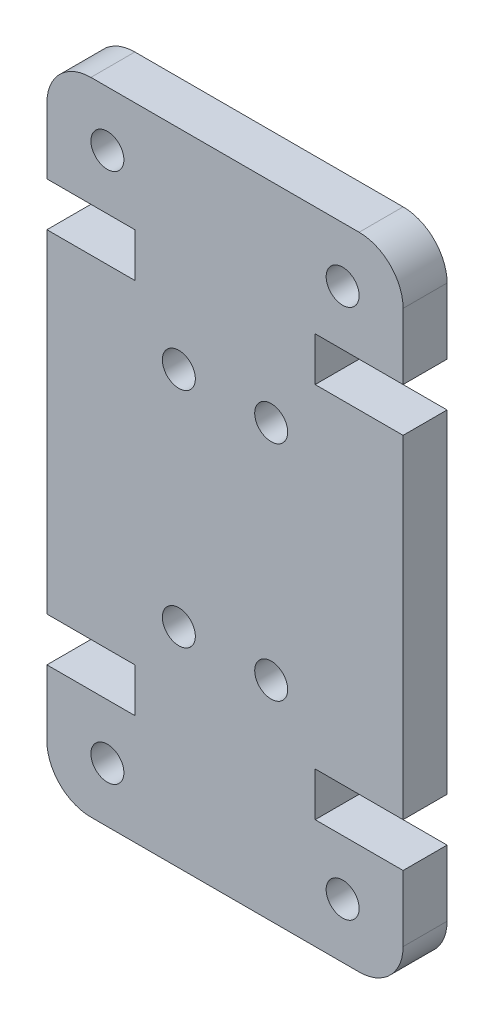
ISO-10303-21;
HEADER;
FILE_DESCRIPTION(('STEP AP214'),'2;1');
FILE_NAME('part.step','',(''),(''),'','','');
FILE_SCHEMA(('AUTOMOTIVE_DESIGN { 1 0 10303 214 1 1 1 1 }'));
ENDSEC;
DATA;
#1=APPLICATION_CONTEXT('core data for automotive mechanical design processes');
#2=APPLICATION_PROTOCOL_DEFINITION('international standard','automotive_design',2000,#1);
#3=PRODUCT_CONTEXT('',#1,'mechanical');
#4=PRODUCT('Part','Part','',(#3));
#5=PRODUCT_RELATED_PRODUCT_CATEGORY('part','',(#4));
#6=PRODUCT_DEFINITION_FORMATION('','',#4);
#7=PRODUCT_DEFINITION_CONTEXT('part definition',#1,'design');
#8=PRODUCT_DEFINITION('design','',#6,#7);
#9=PRODUCT_DEFINITION_SHAPE('','',#8);
#10=(LENGTH_UNIT() NAMED_UNIT(*) SI_UNIT(.MILLI.,.METRE.));
#11=(NAMED_UNIT(*) PLANE_ANGLE_UNIT() SI_UNIT($,.RADIAN.));
#12=(NAMED_UNIT(*) SI_UNIT($,.STERADIAN.) SOLID_ANGLE_UNIT());
#13=UNCERTAINTY_MEASURE_WITH_UNIT(LENGTH_MEASURE(1.E-05),#10,'distance_accuracy_value','');
#14=(GEOMETRIC_REPRESENTATION_CONTEXT(3) GLOBAL_UNCERTAINTY_ASSIGNED_CONTEXT((#13)) GLOBAL_UNIT_ASSIGNED_CONTEXT((#10,
#11,#12)) REPRESENTATION_CONTEXT('',''));
#15=CARTESIAN_POINT('',(0.,0.,0.));
#16=DIRECTION('',(0.,0.,1.));
#17=DIRECTION('',(1.,0.,0.));
#18=AXIS2_PLACEMENT_3D('',#15,#16,#17);
#19=CARTESIAN_POINT('',(2.00000000000002,2.,2.));
#20=DIRECTION('',(0.,0.,1.));
#21=DIRECTION('',(1.,0.,0.));
#22=AXIS2_PLACEMENT_3D('',#19,#20,#21);
#23=PLANE('',#22);
#24=CARTESIAN_POINT('',(10.2,19.6400000000004,2.));
#25=DIRECTION('',(0.,0.,1.));
#26=DIRECTION('',(1.,0.,0.));
#27=AXIS2_PLACEMENT_3D('',#24,#25,#26);
#28=CIRCLE('',#27,0.750000000000002);
#29=CARTESIAN_POINT('',(10.95,19.6400000000004,2.));
#30=VERTEX_POINT('',#29);
#31=EDGE_CURVE('E465',#30,#30,#28,.T.);
#32=ORIENTED_EDGE('',*,*,#31,.F.);
#33=EDGE_LOOP('',(#32));
#34=FACE_BOUND('',#33,.T.);
#35=CARTESIAN_POINT('',(6.,19.6400000000004,2.));
#36=DIRECTION('',(0.,0.,1.));
#37=DIRECTION('',(-1.,0.,0.));
#38=AXIS2_PLACEMENT_3D('',#35,#36,#37);
#39=CIRCLE('',#38,0.750000000000001);
#40=CARTESIAN_POINT('',(5.25,19.6400000000004,2.));
#41=VERTEX_POINT('',#40);
#42=EDGE_CURVE('E477',#41,#41,#39,.T.);
#43=ORIENTED_EDGE('',*,*,#42,.F.);
#44=EDGE_LOOP('',(#43));
#45=FACE_BOUND('',#44,.T.);
#46=CARTESIAN_POINT('',(2.75000000000004,26.6399999999998,2.));
#47=DIRECTION('',(0.,0.,1.));
#48=DIRECTION('',(-1.,0.,0.));
#49=AXIS2_PLACEMENT_3D('',#46,#47,#48);
#50=CIRCLE('',#49,0.750000000000001);
#51=CARTESIAN_POINT('',(2.00000000000004,26.6399999999998,2.));
#52=VERTEX_POINT('',#51);
#53=EDGE_CURVE('E489',#52,#52,#50,.T.);
#54=ORIENTED_EDGE('',*,*,#53,.F.);
#55=EDGE_LOOP('',(#54));
#56=FACE_BOUND('',#55,.T.);
#57=CARTESIAN_POINT('',(13.45,2.50000000000017,2.));
#58=DIRECTION('',(0.,0.,1.));
#59=DIRECTION('',(-1.,0.,0.));
#60=AXIS2_PLACEMENT_3D('',#57,#58,#59);
#61=CIRCLE('',#60,0.750000000000002);
#62=CARTESIAN_POINT('',(12.7,2.50000000000017,2.));
#63=VERTEX_POINT('',#62);
#64=EDGE_CURVE('E231',#63,#63,#61,.T.);
#65=ORIENTED_EDGE('',*,*,#64,.F.);
#66=EDGE_LOOP('',(#65));
#67=FACE_BOUND('',#66,.T.);
#68=DIRECTION('',(1.,0.,0.));
#69=VECTOR('',#68,1.);
#70=CARTESIAN_POINT('',(0.,6.99999999999946,2.));
#71=LINE('',#70,#69);
#72=CARTESIAN_POINT('',(0.,6.99999999999946,2.));
#73=VERTEX_POINT('',#72);
#74=CARTESIAN_POINT('',(4.00000000000002,6.99999999999946,2.));
#75=VERTEX_POINT('',#74);
#76=EDGE_CURVE('E274',#73,#75,#71,.T.);
#77=ORIENTED_EDGE('',*,*,#76,.T.);
#78=DIRECTION('',(0.,-1.,0.));
#79=VECTOR('',#78,1.);
#80=CARTESIAN_POINT('',(4.00000000000002,6.99999999999946,2.));
#81=LINE('',#80,#79);
#82=CARTESIAN_POINT('',(4.,4.99999999999945,2.));
#83=VERTEX_POINT('',#82);
#84=EDGE_CURVE('E142',#75,#83,#81,.T.);
#85=ORIENTED_EDGE('',*,*,#84,.T.);
#86=DIRECTION('',(-1.,0.,0.));
#87=VECTOR('',#86,1.);
#88=CARTESIAN_POINT('',(4.,4.99999999999945,2.));
#89=LINE('',#88,#87);
#90=CARTESIAN_POINT('',(0.,4.99999999999945,2.));
#91=VERTEX_POINT('',#90);
#92=EDGE_CURVE('E337',#83,#91,#89,.T.);
#93=ORIENTED_EDGE('',*,*,#92,.T.);
#94=DIRECTION('',(0.,-1.,0.));
#95=VECTOR('',#94,1.);
#96=CARTESIAN_POINT('',(0.,2.,2.));
#97=LINE('',#96,#95);
#98=CARTESIAN_POINT('',(0.,2.,2.));
#99=VERTEX_POINT('',#98);
#100=EDGE_CURVE('E356',#91,#99,#97,.T.);
#101=ORIENTED_EDGE('',*,*,#100,.T.);
#102=CARTESIAN_POINT('',(2.00000000000002,2.,2.));
#103=DIRECTION('',(0.,0.,1.));
#104=DIRECTION('',(1.,0.,0.));
#105=AXIS2_PLACEMENT_3D('',#102,#103,#104);
#106=CIRCLE('',#105,2.00000000000001);
#107=CARTESIAN_POINT('',(2.00000000000002,0.,2.));
#108=VERTEX_POINT('',#107);
#109=EDGE_CURVE('E353',#99,#108,#106,.T.);
#110=ORIENTED_EDGE('',*,*,#109,.T.);
#111=DIRECTION('',(1.,0.,0.));
#112=VECTOR('',#111,1.);
#113=CARTESIAN_POINT('',(2.00000000000002,0.,2.));
#114=LINE('',#113,#112);
#115=CARTESIAN_POINT('',(14.2,0.,2.));
#116=VERTEX_POINT('',#115);
#117=EDGE_CURVE('E355',#108,#116,#114,.T.);
#118=ORIENTED_EDGE('',*,*,#117,.T.);
#119=CARTESIAN_POINT('',(14.2,2.,2.));
#120=DIRECTION('',(0.,0.,1.));
#121=DIRECTION('',(-1.,0.,0.));
#122=AXIS2_PLACEMENT_3D('',#119,#120,#121);
#123=CIRCLE('',#122,2.);
#124=CARTESIAN_POINT('',(16.2,2.,2.));
#125=VERTEX_POINT('',#124);
#126=EDGE_CURVE('E358',#116,#125,#123,.T.);
#127=ORIENTED_EDGE('',*,*,#126,.T.);
#128=DIRECTION('',(0.,1.,0.));
#129=VECTOR('',#128,1.);
#130=CARTESIAN_POINT('',(16.2,2.,2.));
#131=LINE('',#130,#129);
#132=CARTESIAN_POINT('',(16.2,4.99999999999945,2.));
#133=VERTEX_POINT('',#132);
#134=EDGE_CURVE('E364',#125,#133,#131,.T.);
#135=ORIENTED_EDGE('',*,*,#134,.T.);
#136=DIRECTION('',(-1.,0.,0.));
#137=VECTOR('',#136,1.);
#138=CARTESIAN_POINT('',(12.2,4.99999999999945,2.));
#139=LINE('',#138,#137);
#140=CARTESIAN_POINT('',(12.2,4.99999999999945,2.));
#141=VERTEX_POINT('',#140);
#142=EDGE_CURVE('E366',#133,#141,#139,.T.);
#143=ORIENTED_EDGE('',*,*,#142,.T.);
#144=DIRECTION('',(0.,1.,0.));
#145=VECTOR('',#144,1.);
#146=CARTESIAN_POINT('',(12.2,6.99999999999945,2.));
#147=LINE('',#146,#145);
#148=CARTESIAN_POINT('',(12.2,6.99999999999945,2.));
#149=VERTEX_POINT('',#148);
#150=EDGE_CURVE('E368',#141,#149,#147,.T.);
#151=ORIENTED_EDGE('',*,*,#150,.T.);
#152=DIRECTION('',(1.,0.,0.));
#153=VECTOR('',#152,1.);
#154=CARTESIAN_POINT('',(16.2,6.99999999999945,2.));
#155=LINE('',#154,#153);
#156=CARTESIAN_POINT('',(16.2,6.99999999999945,2.));
#157=VERTEX_POINT('',#156);
#158=EDGE_CURVE('E370',#149,#157,#155,.T.);
#159=ORIENTED_EDGE('',*,*,#158,.T.);
#160=DIRECTION('',(0.,1.,0.));
#161=VECTOR('',#160,1.);
#162=CARTESIAN_POINT('',(16.2,22.1400000000005,2.));
#163=LINE('',#162,#161);
#164=CARTESIAN_POINT('',(16.2,22.1400000000005,2.));
#165=VERTEX_POINT('',#164);
#166=EDGE_CURVE('E372',#157,#165,#163,.T.);
#167=ORIENTED_EDGE('',*,*,#166,.T.);
#168=DIRECTION('',(-1.,0.,0.));
#169=VECTOR('',#168,1.);
#170=CARTESIAN_POINT('',(16.2,22.1400000000005,2.));
#171=LINE('',#170,#169);
#172=CARTESIAN_POINT('',(12.2,22.1400000000005,2.));
#173=VERTEX_POINT('',#172);
#174=EDGE_CURVE('E374',#165,#173,#171,.T.);
#175=ORIENTED_EDGE('',*,*,#174,.T.);
#176=DIRECTION('',(0.,1.,0.));
#177=VECTOR('',#176,1.);
#178=CARTESIAN_POINT('',(12.2,22.1400000000005,2.));
#179=LINE('',#178,#177);
#180=CARTESIAN_POINT('',(12.2,24.1400000000006,2.));
#181=VERTEX_POINT('',#180);
#182=EDGE_CURVE('E376',#173,#181,#179,.T.);
#183=ORIENTED_EDGE('',*,*,#182,.T.);
#184=DIRECTION('',(1.,0.,0.));
#185=VECTOR('',#184,1.);
#186=CARTESIAN_POINT('',(12.2,24.1400000000006,2.));
#187=LINE('',#186,#185);
#188=CARTESIAN_POINT('',(16.2,24.1400000000006,2.));
#189=VERTEX_POINT('',#188);
#190=EDGE_CURVE('E378',#181,#189,#187,.T.);
#191=ORIENTED_EDGE('',*,*,#190,.T.);
#192=DIRECTION('',(0.,1.,0.));
#193=VECTOR('',#192,1.);
#194=CARTESIAN_POINT('',(16.2,27.14,2.));
#195=LINE('',#194,#193);
#196=CARTESIAN_POINT('',(16.2,27.14,2.));
#197=VERTEX_POINT('',#196);
#198=EDGE_CURVE('E380',#189,#197,#195,.T.);
#199=ORIENTED_EDGE('',*,*,#198,.T.);
#200=CARTESIAN_POINT('',(14.2,27.14,2.));
#201=DIRECTION('',(0.,0.,1.));
#202=DIRECTION('',(1.,0.,0.));
#203=AXIS2_PLACEMENT_3D('',#200,#201,#202);
#204=CIRCLE('',#203,2.);
#205=CARTESIAN_POINT('',(14.2,29.14,2.));
#206=VERTEX_POINT('',#205);
#207=EDGE_CURVE('E382',#197,#206,#204,.T.);
#208=ORIENTED_EDGE('',*,*,#207,.T.);
#209=DIRECTION('',(-1.,0.,0.));
#210=VECTOR('',#209,1.);
#211=CARTESIAN_POINT('',(1.99999999999999,29.14,2.));
#212=LINE('',#211,#210);
#213=CARTESIAN_POINT('',(1.99999999999999,29.14,2.));
#214=VERTEX_POINT('',#213);
#215=EDGE_CURVE('E384',#206,#214,#212,.T.);
#216=ORIENTED_EDGE('',*,*,#215,.T.);
#217=CARTESIAN_POINT('',(2.,27.14,2.));
#218=DIRECTION('',(0.,0.,1.));
#219=DIRECTION('',(-1.,0.,0.));
#220=AXIS2_PLACEMENT_3D('',#217,#218,#219);
#221=CIRCLE('',#220,2.);
#222=CARTESIAN_POINT('',(0.,27.14,2.));
#223=VERTEX_POINT('',#222);
#224=EDGE_CURVE('E386',#214,#223,#221,.T.);
#225=ORIENTED_EDGE('',*,*,#224,.T.);
#226=DIRECTION('',(0.,-1.,0.));
#227=VECTOR('',#226,1.);
#228=CARTESIAN_POINT('',(0.,27.14,2.));
#229=LINE('',#228,#227);
#230=CARTESIAN_POINT('',(0.,24.1400000000005,2.));
#231=VERTEX_POINT('',#230);
#232=EDGE_CURVE('E388',#223,#231,#229,.T.);
#233=ORIENTED_EDGE('',*,*,#232,.T.);
#234=DIRECTION('',(1.,0.,0.));
#235=VECTOR('',#234,1.);
#236=CARTESIAN_POINT('',(3.99999999999999,24.1400000000006,2.));
#237=LINE('',#236,#235);
#238=CARTESIAN_POINT('',(3.99999999999999,24.1400000000006,2.));
#239=VERTEX_POINT('',#238);
#240=EDGE_CURVE('E209',#231,#239,#237,.T.);
#241=ORIENTED_EDGE('',*,*,#240,.T.);
#242=DIRECTION('',(0.,-1.,0.));
#243=VECTOR('',#242,1.);
#244=CARTESIAN_POINT('',(4.,22.1400000000005,2.));
#245=LINE('',#244,#243);
#246=CARTESIAN_POINT('',(4.,22.1400000000005,2.));
#247=VERTEX_POINT('',#246);
#248=EDGE_CURVE('E203',#239,#247,#245,.T.);
#249=ORIENTED_EDGE('',*,*,#248,.T.);
#250=DIRECTION('',(-1.,0.,0.));
#251=VECTOR('',#250,1.);
#252=CARTESIAN_POINT('',(0.,22.1400000000005,2.));
#253=LINE('',#252,#251);
#254=CARTESIAN_POINT('',(0.,22.1400000000005,2.));
#255=VERTEX_POINT('',#254);
#256=EDGE_CURVE('E207',#247,#255,#253,.T.);
#257=ORIENTED_EDGE('',*,*,#256,.T.);
#258=DIRECTION('',(0.,-1.,0.));
#259=VECTOR('',#258,1.);
#260=CARTESIAN_POINT('',(0.,22.1400000000005,2.));
#261=LINE('',#260,#259);
#262=EDGE_CURVE('E51',#255,#73,#261,.T.);
#263=ORIENTED_EDGE('',*,*,#262,.T.);
#264=EDGE_LOOP('',(#77,#85,#93,#101,#110,#118,#127,#135,#143,#151,#159,#167,#175,#183,#191,#199,
#208,#216,#225,#233,#241,#249,#257,#263));
#265=FACE_BOUND('',#264,.T.);
#266=CARTESIAN_POINT('',(10.2,9.49999999999962,2.));
#267=DIRECTION('',(0.,0.,1.));
#268=DIRECTION('',(-1.,0.,0.));
#269=AXIS2_PLACEMENT_3D('',#266,#267,#268);
#270=CIRCLE('',#269,0.750000000000002);
#271=CARTESIAN_POINT('',(9.44999999999999,9.49999999999962,2.));
#272=VERTEX_POINT('',#271);
#273=EDGE_CURVE('E495',#272,#272,#270,.T.);
#274=ORIENTED_EDGE('',*,*,#273,.F.);
#275=EDGE_LOOP('',(#274));
#276=FACE_BOUND('',#275,.T.);
#277=CARTESIAN_POINT('',(6.00000000000001,9.49999999999962,2.));
#278=DIRECTION('',(0.,0.,1.));
#279=DIRECTION('',(1.,0.,0.));
#280=AXIS2_PLACEMENT_3D('',#277,#278,#279);
#281=CIRCLE('',#280,0.75);
#282=CARTESIAN_POINT('',(6.75000000000001,9.49999999999962,2.));
#283=VERTEX_POINT('',#282);
#284=EDGE_CURVE('E483',#283,#283,#281,.T.);
#285=ORIENTED_EDGE('',*,*,#284,.F.);
#286=EDGE_LOOP('',(#285));
#287=FACE_BOUND('',#286,.T.);
#288=CARTESIAN_POINT('',(2.75000000000004,2.50000000000017,2.));
#289=DIRECTION('',(0.,0.,1.));
#290=DIRECTION('',(1.,0.,0.));
#291=AXIS2_PLACEMENT_3D('',#288,#289,#290);
#292=CIRCLE('',#291,0.75);
#293=CARTESIAN_POINT('',(3.50000000000004,2.50000000000017,2.));
#294=VERTEX_POINT('',#293);
#295=EDGE_CURVE('E471',#294,#294,#292,.T.);
#296=ORIENTED_EDGE('',*,*,#295,.F.);
#297=EDGE_LOOP('',(#296));
#298=FACE_BOUND('',#297,.T.);
#299=CARTESIAN_POINT('',(13.45,26.6399999999998,2.));
#300=DIRECTION('',(0.,0.,1.));
#301=DIRECTION('',(1.,0.,0.));
#302=AXIS2_PLACEMENT_3D('',#299,#300,#301);
#303=CIRCLE('',#302,0.750000000000002);
#304=CARTESIAN_POINT('',(14.2,26.6399999999998,2.));
#305=VERTEX_POINT('',#304);
#306=EDGE_CURVE('E456',#305,#305,#303,.T.);
#307=ORIENTED_EDGE('',*,*,#306,.F.);
#308=EDGE_LOOP('',(#307));
#309=FACE_BOUND('',#308,.T.);
#310=ADVANCED_FACE('F34',(#34,#45,#56,#67,#265,#276,#287,#298,#309),#23,.T.);
#311=CARTESIAN_POINT('',(2.00000000000002,2.,0.));
#312=DIRECTION('',(0.,0.,1.));
#313=DIRECTION('',(1.,0.,0.));
#314=AXIS2_PLACEMENT_3D('',#311,#312,#313);
#315=PLANE('',#314);
#316=CARTESIAN_POINT('',(10.2,19.6400000000004,0.));
#317=DIRECTION('',(0.,0.,1.));
#318=DIRECTION('',(1.,0.,0.));
#319=AXIS2_PLACEMENT_3D('',#316,#317,#318);
#320=CIRCLE('',#319,0.750000000000002);
#321=CARTESIAN_POINT('',(10.95,19.6400000000004,0.));
#322=VERTEX_POINT('',#321);
#323=EDGE_CURVE('E462',#322,#322,#320,.T.);
#324=ORIENTED_EDGE('',*,*,#323,.T.);
#325=EDGE_LOOP('',(#324));
#326=FACE_BOUND('',#325,.T.);
#327=CARTESIAN_POINT('',(6.,19.6400000000004,0.));
#328=DIRECTION('',(0.,0.,1.));
#329=DIRECTION('',(-1.,0.,0.));
#330=AXIS2_PLACEMENT_3D('',#327,#328,#329);
#331=CIRCLE('',#330,0.750000000000001);
#332=CARTESIAN_POINT('',(5.25,19.6400000000004,0.));
#333=VERTEX_POINT('',#332);
#334=EDGE_CURVE('E474',#333,#333,#331,.T.);
#335=ORIENTED_EDGE('',*,*,#334,.T.);
#336=EDGE_LOOP('',(#335));
#337=FACE_BOUND('',#336,.T.);
#338=CARTESIAN_POINT('',(2.75000000000004,26.6399999999998,0.));
#339=DIRECTION('',(0.,0.,1.));
#340=DIRECTION('',(-1.,0.,0.));
#341=AXIS2_PLACEMENT_3D('',#338,#339,#340);
#342=CIRCLE('',#341,0.750000000000001);
#343=CARTESIAN_POINT('',(2.00000000000004,26.6399999999998,0.));
#344=VERTEX_POINT('',#343);
#345=EDGE_CURVE('E486',#344,#344,#342,.T.);
#346=ORIENTED_EDGE('',*,*,#345,.T.);
#347=EDGE_LOOP('',(#346));
#348=FACE_BOUND('',#347,.T.);
#349=CARTESIAN_POINT('',(13.45,2.50000000000017,0.));
#350=DIRECTION('',(0.,0.,1.));
#351=DIRECTION('',(-1.,0.,0.));
#352=AXIS2_PLACEMENT_3D('',#349,#350,#351);
#353=CIRCLE('',#352,0.750000000000002);
#354=CARTESIAN_POINT('',(12.7,2.50000000000017,0.));
#355=VERTEX_POINT('',#354);
#356=EDGE_CURVE('E498',#355,#355,#353,.T.);
#357=ORIENTED_EDGE('',*,*,#356,.T.);
#358=EDGE_LOOP('',(#357));
#359=FACE_BOUND('',#358,.T.);
#360=DIRECTION('',(1.,0.,0.));
#361=VECTOR('',#360,1.);
#362=CARTESIAN_POINT('',(0.,6.99999999999946,0.));
#363=LINE('',#362,#361);
#364=CARTESIAN_POINT('',(0.,6.99999999999946,0.));
#365=VERTEX_POINT('',#364);
#366=CARTESIAN_POINT('',(4.00000000000002,6.99999999999946,0.));
#367=VERTEX_POINT('',#366);
#368=EDGE_CURVE('E227',#365,#367,#363,.T.);
#369=ORIENTED_EDGE('',*,*,#368,.F.);
#370=DIRECTION('',(0.,-1.,0.));
#371=VECTOR('',#370,1.);
#372=CARTESIAN_POINT('',(0.,22.1400000000005,0.));
#373=LINE('',#372,#371);
#374=CARTESIAN_POINT('',(0.,22.1400000000005,0.));
#375=VERTEX_POINT('',#374);
#376=EDGE_CURVE('E134',#375,#365,#373,.T.);
#377=ORIENTED_EDGE('',*,*,#376,.F.);
#378=DIRECTION('',(-1.,0.,0.));
#379=VECTOR('',#378,1.);
#380=CARTESIAN_POINT('',(0.,22.1400000000005,0.));
#381=LINE('',#380,#379);
#382=CARTESIAN_POINT('',(4.,22.1400000000005,0.));
#383=VERTEX_POINT('',#382);
#384=EDGE_CURVE('E128',#383,#375,#381,.T.);
#385=ORIENTED_EDGE('',*,*,#384,.F.);
#386=DIRECTION('',(0.,-1.,0.));
#387=VECTOR('',#386,1.);
#388=CARTESIAN_POINT('',(4.,22.1400000000005,0.));
#389=LINE('',#388,#387);
#390=CARTESIAN_POINT('',(3.99999999999999,24.1400000000006,0.));
#391=VERTEX_POINT('',#390);
#392=EDGE_CURVE('E217',#391,#383,#389,.T.);
#393=ORIENTED_EDGE('',*,*,#392,.F.);
#394=DIRECTION('',(1.,0.,0.));
#395=VECTOR('',#394,1.);
#396=CARTESIAN_POINT('',(3.99999999999999,24.1400000000006,0.));
#397=LINE('',#396,#395);
#398=CARTESIAN_POINT('',(0.,24.1400000000005,0.));
#399=VERTEX_POINT('',#398);
#400=EDGE_CURVE('E269',#399,#391,#397,.T.);
#401=ORIENTED_EDGE('',*,*,#400,.F.);
#402=DIRECTION('',(0.,-1.,0.));
#403=VECTOR('',#402,1.);
#404=CARTESIAN_POINT('',(0.,27.14,0.));
#405=LINE('',#404,#403);
#406=CARTESIAN_POINT('',(0.,27.14,0.));
#407=VERTEX_POINT('',#406);
#408=EDGE_CURVE('E267',#407,#399,#405,.T.);
#409=ORIENTED_EDGE('',*,*,#408,.F.);
#410=CARTESIAN_POINT('',(2.,27.14,0.));
#411=DIRECTION('',(0.,0.,1.));
#412=DIRECTION('',(-1.,0.,0.));
#413=AXIS2_PLACEMENT_3D('',#410,#411,#412);
#414=CIRCLE('',#413,2.);
#415=CARTESIAN_POINT('',(1.99999999999999,29.14,0.));
#416=VERTEX_POINT('',#415);
#417=EDGE_CURVE('E265',#416,#407,#414,.T.);
#418=ORIENTED_EDGE('',*,*,#417,.F.);
#419=DIRECTION('',(-1.,0.,0.));
#420=VECTOR('',#419,1.);
#421=CARTESIAN_POINT('',(1.99999999999999,29.14,0.));
#422=LINE('',#421,#420);
#423=CARTESIAN_POINT('',(14.2,29.14,0.));
#424=VERTEX_POINT('',#423);
#425=EDGE_CURVE('E263',#424,#416,#422,.T.);
#426=ORIENTED_EDGE('',*,*,#425,.F.);
#427=CARTESIAN_POINT('',(14.2,27.14,0.));
#428=DIRECTION('',(0.,0.,1.));
#429=DIRECTION('',(1.,0.,0.));
#430=AXIS2_PLACEMENT_3D('',#427,#428,#429);
#431=CIRCLE('',#430,2.);
#432=CARTESIAN_POINT('',(16.2,27.14,0.));
#433=VERTEX_POINT('',#432);
#434=EDGE_CURVE('E261',#433,#424,#431,.T.);
#435=ORIENTED_EDGE('',*,*,#434,.F.);
#436=DIRECTION('',(0.,1.,0.));
#437=VECTOR('',#436,1.);
#438=CARTESIAN_POINT('',(16.2,27.14,0.));
#439=LINE('',#438,#437);
#440=CARTESIAN_POINT('',(16.2,24.1400000000006,0.));
#441=VERTEX_POINT('',#440);
#442=EDGE_CURVE('E259',#441,#433,#439,.T.);
#443=ORIENTED_EDGE('',*,*,#442,.F.);
#444=DIRECTION('',(1.,0.,0.));
#445=VECTOR('',#444,1.);
#446=CARTESIAN_POINT('',(12.2,24.1400000000006,0.));
#447=LINE('',#446,#445);
#448=CARTESIAN_POINT('',(12.2,24.1400000000006,0.));
#449=VERTEX_POINT('',#448);
#450=EDGE_CURVE('E257',#449,#441,#447,.T.);
#451=ORIENTED_EDGE('',*,*,#450,.F.);
#452=DIRECTION('',(0.,1.,0.));
#453=VECTOR('',#452,1.);
#454=CARTESIAN_POINT('',(12.2,22.1400000000005,0.));
#455=LINE('',#454,#453);
#456=CARTESIAN_POINT('',(12.2,22.1400000000005,0.));
#457=VERTEX_POINT('',#456);
#458=EDGE_CURVE('E255',#457,#449,#455,.T.);
#459=ORIENTED_EDGE('',*,*,#458,.F.);
#460=DIRECTION('',(-1.,0.,0.));
#461=VECTOR('',#460,1.);
#462=CARTESIAN_POINT('',(16.2,22.1400000000005,0.));
#463=LINE('',#462,#461);
#464=CARTESIAN_POINT('',(16.2,22.1400000000005,0.));
#465=VERTEX_POINT('',#464);
#466=EDGE_CURVE('E253',#465,#457,#463,.T.);
#467=ORIENTED_EDGE('',*,*,#466,.F.);
#468=DIRECTION('',(0.,1.,0.));
#469=VECTOR('',#468,1.);
#470=CARTESIAN_POINT('',(16.2,22.1400000000005,0.));
#471=LINE('',#470,#469);
#472=CARTESIAN_POINT('',(16.2,6.99999999999945,0.));
#473=VERTEX_POINT('',#472);
#474=EDGE_CURVE('E251',#473,#465,#471,.T.);
#475=ORIENTED_EDGE('',*,*,#474,.F.);
#476=DIRECTION('',(1.,0.,0.));
#477=VECTOR('',#476,1.);
#478=CARTESIAN_POINT('',(16.2,6.99999999999945,0.));
#479=LINE('',#478,#477);
#480=CARTESIAN_POINT('',(12.2,6.99999999999945,0.));
#481=VERTEX_POINT('',#480);
#482=EDGE_CURVE('E249',#481,#473,#479,.T.);
#483=ORIENTED_EDGE('',*,*,#482,.F.);
#484=DIRECTION('',(0.,1.,0.));
#485=VECTOR('',#484,1.);
#486=CARTESIAN_POINT('',(12.2,6.99999999999945,0.));
#487=LINE('',#486,#485);
#488=CARTESIAN_POINT('',(12.2,4.99999999999945,0.));
#489=VERTEX_POINT('',#488);
#490=EDGE_CURVE('E247',#489,#481,#487,.T.);
#491=ORIENTED_EDGE('',*,*,#490,.F.);
#492=DIRECTION('',(-1.,0.,0.));
#493=VECTOR('',#492,1.);
#494=CARTESIAN_POINT('',(12.2,4.99999999999945,0.));
#495=LINE('',#494,#493);
#496=CARTESIAN_POINT('',(16.2,4.99999999999945,0.));
#497=VERTEX_POINT('',#496);
#498=EDGE_CURVE('E245',#497,#489,#495,.T.);
#499=ORIENTED_EDGE('',*,*,#498,.F.);
#500=DIRECTION('',(0.,1.,0.));
#501=VECTOR('',#500,1.);
#502=CARTESIAN_POINT('',(16.2,2.,0.));
#503=LINE('',#502,#501);
#504=CARTESIAN_POINT('',(16.2,2.,0.));
#505=VERTEX_POINT('',#504);
#506=EDGE_CURVE('E243',#505,#497,#503,.T.);
#507=ORIENTED_EDGE('',*,*,#506,.F.);
#508=CARTESIAN_POINT('',(14.2,2.,0.));
#509=DIRECTION('',(0.,0.,1.));
#510=DIRECTION('',(-1.,0.,0.));
#511=AXIS2_PLACEMENT_3D('',#508,#509,#510);
#512=CIRCLE('',#511,2.);
#513=CARTESIAN_POINT('',(14.2,0.,0.));
#514=VERTEX_POINT('',#513);
#515=EDGE_CURVE('E241',#514,#505,#512,.T.);
#516=ORIENTED_EDGE('',*,*,#515,.F.);
#517=DIRECTION('',(1.,0.,0.));
#518=VECTOR('',#517,1.);
#519=CARTESIAN_POINT('',(2.00000000000002,0.,0.));
#520=LINE('',#519,#518);
#521=CARTESIAN_POINT('',(2.00000000000002,0.,0.));
#522=VERTEX_POINT('',#521);
#523=EDGE_CURVE('E239',#522,#514,#520,.T.);
#524=ORIENTED_EDGE('',*,*,#523,.F.);
#525=CARTESIAN_POINT('',(2.00000000000002,2.,0.));
#526=DIRECTION('',(0.,0.,1.));
#527=DIRECTION('',(1.,0.,0.));
#528=AXIS2_PLACEMENT_3D('',#525,#526,#527);
#529=CIRCLE('',#528,2.00000000000001);
#530=CARTESIAN_POINT('',(0.,2.,0.));
#531=VERTEX_POINT('',#530);
#532=EDGE_CURVE('E237',#531,#522,#529,.T.);
#533=ORIENTED_EDGE('',*,*,#532,.F.);
#534=DIRECTION('',(0.,-1.,0.));
#535=VECTOR('',#534,1.);
#536=CARTESIAN_POINT('',(0.,2.,0.));
#537=LINE('',#536,#535);
#538=CARTESIAN_POINT('',(0.,4.99999999999945,0.));
#539=VERTEX_POINT('',#538);
#540=EDGE_CURVE('E235',#539,#531,#537,.T.);
#541=ORIENTED_EDGE('',*,*,#540,.F.);
#542=DIRECTION('',(-1.,0.,0.));
#543=VECTOR('',#542,1.);
#544=CARTESIAN_POINT('',(4.,4.99999999999945,0.));
#545=LINE('',#544,#543);
#546=CARTESIAN_POINT('',(4.,4.99999999999945,0.));
#547=VERTEX_POINT('',#546);
#548=EDGE_CURVE('E233',#547,#539,#545,.T.);
#549=ORIENTED_EDGE('',*,*,#548,.F.);
#550=DIRECTION('',(0.,-1.,0.));
#551=VECTOR('',#550,1.);
#552=CARTESIAN_POINT('',(4.00000000000002,6.99999999999946,0.));
#553=LINE('',#552,#551);
#554=EDGE_CURVE('E230',#367,#547,#553,.T.);
#555=ORIENTED_EDGE('',*,*,#554,.F.);
#556=EDGE_LOOP('',(#369,#377,#385,#393,#401,#409,#418,#426,#435,#443,#451,#459,#467,#475,#483,
#491,#499,#507,#516,#524,#533,#541,#549,#555));
#557=FACE_BOUND('',#556,.T.);
#558=CARTESIAN_POINT('',(10.2,9.49999999999962,0.));
#559=DIRECTION('',(0.,0.,1.));
#560=DIRECTION('',(-1.,0.,0.));
#561=AXIS2_PLACEMENT_3D('',#558,#559,#560);
#562=CIRCLE('',#561,0.750000000000002);
#563=CARTESIAN_POINT('',(9.44999999999999,9.49999999999962,0.));
#564=VERTEX_POINT('',#563);
#565=EDGE_CURVE('E492',#564,#564,#562,.T.);
#566=ORIENTED_EDGE('',*,*,#565,.T.);
#567=EDGE_LOOP('',(#566));
#568=FACE_BOUND('',#567,.T.);
#569=CARTESIAN_POINT('',(6.00000000000001,9.49999999999962,0.));
#570=DIRECTION('',(0.,0.,1.));
#571=DIRECTION('',(1.,0.,0.));
#572=AXIS2_PLACEMENT_3D('',#569,#570,#571);
#573=CIRCLE('',#572,0.75);
#574=CARTESIAN_POINT('',(6.75000000000001,9.49999999999962,0.));
#575=VERTEX_POINT('',#574);
#576=EDGE_CURVE('E480',#575,#575,#573,.T.);
#577=ORIENTED_EDGE('',*,*,#576,.T.);
#578=EDGE_LOOP('',(#577));
#579=FACE_BOUND('',#578,.T.);
#580=CARTESIAN_POINT('',(2.75000000000004,2.50000000000017,0.));
#581=DIRECTION('',(0.,0.,1.));
#582=DIRECTION('',(1.,0.,0.));
#583=AXIS2_PLACEMENT_3D('',#580,#581,#582);
#584=CIRCLE('',#583,0.75);
#585=CARTESIAN_POINT('',(3.50000000000004,2.50000000000017,0.));
#586=VERTEX_POINT('',#585);
#587=EDGE_CURVE('E468',#586,#586,#584,.T.);
#588=ORIENTED_EDGE('',*,*,#587,.T.);
#589=EDGE_LOOP('',(#588));
#590=FACE_BOUND('',#589,.T.);
#591=CARTESIAN_POINT('',(13.45,26.6399999999998,0.));
#592=DIRECTION('',(0.,0.,1.));
#593=DIRECTION('',(1.,0.,0.));
#594=AXIS2_PLACEMENT_3D('',#591,#592,#593);
#595=CIRCLE('',#594,0.750000000000002);
#596=CARTESIAN_POINT('',(14.2,26.6399999999998,0.));
#597=VERTEX_POINT('',#596);
#598=EDGE_CURVE('E459',#597,#597,#595,.T.);
#599=ORIENTED_EDGE('',*,*,#598,.T.);
#600=EDGE_LOOP('',(#599));
#601=FACE_BOUND('',#600,.T.);
#602=ADVANCED_FACE('F341',(#326,#337,#348,#359,#557,#568,#579,#590,#601),#315,.F.);
#603=CARTESIAN_POINT('',(0.,6.99999999999946,2.));
#604=DIRECTION('',(0.,1.,0.));
#605=DIRECTION('',(0.,0.,1.));
#606=AXIS2_PLACEMENT_3D('',#603,#604,#605);
#607=PLANE('',#606);
#608=ORIENTED_EDGE('',*,*,#368,.T.);
#609=DIRECTION('',(0.,0.,-1.));
#610=VECTOR('',#609,1.);
#611=CARTESIAN_POINT('',(4.00000000000002,6.99999999999946,2.));
#612=LINE('',#611,#610);
#613=EDGE_CURVE('E11',#75,#367,#612,.T.);
#614=ORIENTED_EDGE('',*,*,#613,.F.);
#615=ORIENTED_EDGE('',*,*,#76,.F.);
#616=DIRECTION('',(0.,0.,-1.));
#617=VECTOR('',#616,1.);
#618=CARTESIAN_POINT('',(0.,6.99999999999946,2.));
#619=LINE('',#618,#617);
#620=EDGE_CURVE('E223',#73,#365,#619,.T.);
#621=ORIENTED_EDGE('',*,*,#620,.T.);
#622=EDGE_LOOP('',(#608,#614,#615,#621));
#623=FACE_BOUND('',#622,.T.);
#624=ADVANCED_FACE('F36',(#623),#607,.F.);
#625=CARTESIAN_POINT('',(4.00000000000002,6.99999999999946,2.));
#626=DIRECTION('',(1.,0.,0.));
#627=DIRECTION('',(0.,1.,0.));
#628=AXIS2_PLACEMENT_3D('',#625,#626,#627);
#629=PLANE('',#628);
#630=ORIENTED_EDGE('',*,*,#554,.T.);
#631=DIRECTION('',(0.,0.,-1.));
#632=VECTOR('',#631,1.);
#633=CARTESIAN_POINT('',(4.,4.99999999999945,2.));
#634=LINE('',#633,#632);
#635=EDGE_CURVE('E43',#83,#547,#634,.T.);
#636=ORIENTED_EDGE('',*,*,#635,.F.);
#637=ORIENTED_EDGE('',*,*,#84,.F.);
#638=ORIENTED_EDGE('',*,*,#613,.T.);
#639=EDGE_LOOP('',(#630,#636,#637,#638));
#640=FACE_BOUND('',#639,.T.);
#641=ADVANCED_FACE('F763',(#640),#629,.F.);
#642=CARTESIAN_POINT('',(4.,4.99999999999945,2.));
#643=DIRECTION('',(0.,-1.,0.));
#644=DIRECTION('',(0.,0.,-1.));
#645=AXIS2_PLACEMENT_3D('',#642,#643,#644);
#646=PLANE('',#645);
#647=ORIENTED_EDGE('',*,*,#548,.T.);
#648=DIRECTION('',(0.,0.,-1.));
#649=VECTOR('',#648,1.);
#650=CARTESIAN_POINT('',(0.,4.99999999999945,2.));
#651=LINE('',#650,#649);
#652=EDGE_CURVE('E329',#91,#539,#651,.T.);
#653=ORIENTED_EDGE('',*,*,#652,.F.);
#654=ORIENTED_EDGE('',*,*,#92,.F.);
#655=ORIENTED_EDGE('',*,*,#635,.T.);
#656=EDGE_LOOP('',(#647,#653,#654,#655));
#657=FACE_BOUND('',#656,.T.);
#658=ADVANCED_FACE('F335',(#657),#646,.F.);
#659=CARTESIAN_POINT('',(0.,2.,2.));
#660=DIRECTION('',(1.,0.,0.));
#661=DIRECTION('',(0.,0.,-1.));
#662=AXIS2_PLACEMENT_3D('',#659,#660,#661);
#663=PLANE('',#662);
#664=ORIENTED_EDGE('',*,*,#540,.T.);
#665=DIRECTION('',(0.,0.,-1.));
#666=VECTOR('',#665,1.);
#667=CARTESIAN_POINT('',(0.,2.,2.));
#668=LINE('',#667,#666);
#669=EDGE_CURVE('E326',#99,#531,#668,.T.);
#670=ORIENTED_EDGE('',*,*,#669,.F.);
#671=ORIENTED_EDGE('',*,*,#100,.F.);
#672=ORIENTED_EDGE('',*,*,#652,.T.);
#673=EDGE_LOOP('',(#664,#670,#671,#672));
#674=FACE_BOUND('',#673,.T.);
#675=ADVANCED_FACE('F347',(#674),#663,.F.);
#676=CARTESIAN_POINT('',(2.00000000000002,2.,2.));
#677=DIRECTION('',(0.,0.,-1.));
#678=DIRECTION('',(-1.,0.,0.));
#679=AXIS2_PLACEMENT_3D('',#676,#677,#678);
#680=CYLINDRICAL_SURFACE('',#679,2.00000000000001);
#681=ORIENTED_EDGE('',*,*,#532,.T.);
#682=DIRECTION('',(0.,0.,-1.));
#683=VECTOR('',#682,1.);
#684=CARTESIAN_POINT('',(2.00000000000002,0.,2.));
#685=LINE('',#684,#683);
#686=EDGE_CURVE('E323',#108,#522,#685,.T.);
#687=ORIENTED_EDGE('',*,*,#686,.F.);
#688=ORIENTED_EDGE('',*,*,#109,.F.);
#689=ORIENTED_EDGE('',*,*,#669,.T.);
#690=EDGE_LOOP('',(#681,#687,#688,#689));
#691=FACE_BOUND('',#690,.T.);
#692=ADVANCED_FACE('F351',(#691),#680,.T.);
#693=CARTESIAN_POINT('',(2.00000000000002,0.,2.));
#694=DIRECTION('',(0.,1.,0.));
#695=DIRECTION('',(-1.,0.,0.));
#696=AXIS2_PLACEMENT_3D('',#693,#694,#695);
#697=PLANE('',#696);
#698=ORIENTED_EDGE('',*,*,#523,.T.);
#699=DIRECTION('',(0.,0.,-1.));
#700=VECTOR('',#699,1.);
#701=CARTESIAN_POINT('',(14.2,0.,2.));
#702=LINE('',#701,#700);
#703=EDGE_CURVE('E320',#116,#514,#702,.T.);
#704=ORIENTED_EDGE('',*,*,#703,.F.);
#705=ORIENTED_EDGE('',*,*,#117,.F.);
#706=ORIENTED_EDGE('',*,*,#686,.T.);
#707=EDGE_LOOP('',(#698,#704,#705,#706));
#708=FACE_BOUND('',#707,.T.);
#709=ADVANCED_FACE('F728',(#708),#697,.F.);
#710=CARTESIAN_POINT('',(14.2,2.,2.));
#711=DIRECTION('',(0.,0.,-1.));
#712=DIRECTION('',(-1.,0.,0.));
#713=AXIS2_PLACEMENT_3D('',#710,#711,#712);
#714=CYLINDRICAL_SURFACE('',#713,2.);
#715=ORIENTED_EDGE('',*,*,#515,.T.);
#716=DIRECTION('',(0.,0.,-1.));
#717=VECTOR('',#716,1.);
#718=CARTESIAN_POINT('',(16.2,2.,2.));
#719=LINE('',#718,#717);
#720=EDGE_CURVE('E317',#125,#505,#719,.T.);
#721=ORIENTED_EDGE('',*,*,#720,.F.);
#722=ORIENTED_EDGE('',*,*,#126,.F.);
#723=ORIENTED_EDGE('',*,*,#703,.T.);
#724=EDGE_LOOP('',(#715,#721,#722,#723));
#725=FACE_BOUND('',#724,.T.);
#726=ADVANCED_FACE('F718',(#725),#714,.T.);
#727=CARTESIAN_POINT('',(16.2,2.,2.));
#728=DIRECTION('',(-1.,0.,0.));
#729=DIRECTION('',(0.,0.,1.));
#730=AXIS2_PLACEMENT_3D('',#727,#728,#729);
#731=PLANE('',#730);
#732=ORIENTED_EDGE('',*,*,#506,.T.);
#733=DIRECTION('',(0.,0.,-1.));
#734=VECTOR('',#733,1.);
#735=CARTESIAN_POINT('',(16.2,4.99999999999945,2.));
#736=LINE('',#735,#734);
#737=EDGE_CURVE('E314',#133,#497,#736,.T.);
#738=ORIENTED_EDGE('',*,*,#737,.F.);
#739=ORIENTED_EDGE('',*,*,#134,.F.);
#740=ORIENTED_EDGE('',*,*,#720,.T.);
#741=EDGE_LOOP('',(#732,#738,#739,#740));
#742=FACE_BOUND('',#741,.T.);
#743=ADVANCED_FACE('F708',(#742),#731,.F.);
#744=CARTESIAN_POINT('',(12.2,4.99999999999945,2.));
#745=DIRECTION('',(0.,-1.,0.));
#746=DIRECTION('',(0.,0.,-1.));
#747=AXIS2_PLACEMENT_3D('',#744,#745,#746);
#748=PLANE('',#747);
#749=ORIENTED_EDGE('',*,*,#498,.T.);
#750=DIRECTION('',(0.,0.,-1.));
#751=VECTOR('',#750,1.);
#752=CARTESIAN_POINT('',(12.2,4.99999999999945,2.));
#753=LINE('',#752,#751);
#754=EDGE_CURVE('E311',#141,#489,#753,.T.);
#755=ORIENTED_EDGE('',*,*,#754,.F.);
#756=ORIENTED_EDGE('',*,*,#142,.F.);
#757=ORIENTED_EDGE('',*,*,#737,.T.);
#758=EDGE_LOOP('',(#749,#755,#756,#757));
#759=FACE_BOUND('',#758,.T.);
#760=ADVANCED_FACE('F698',(#759),#748,.F.);
#761=CARTESIAN_POINT('',(12.2,6.99999999999945,2.));
#762=DIRECTION('',(-1.,0.,0.));
#763=DIRECTION('',(0.,0.,1.));
#764=AXIS2_PLACEMENT_3D('',#761,#762,#763);
#765=PLANE('',#764);
#766=ORIENTED_EDGE('',*,*,#490,.T.);
#767=DIRECTION('',(0.,0.,-1.));
#768=VECTOR('',#767,1.);
#769=CARTESIAN_POINT('',(12.2,6.99999999999945,2.));
#770=LINE('',#769,#768);
#771=EDGE_CURVE('E308',#149,#481,#770,.T.);
#772=ORIENTED_EDGE('',*,*,#771,.F.);
#773=ORIENTED_EDGE('',*,*,#150,.F.);
#774=ORIENTED_EDGE('',*,*,#754,.T.);
#775=EDGE_LOOP('',(#766,#772,#773,#774));
#776=FACE_BOUND('',#775,.T.);
#777=ADVANCED_FACE('F688',(#776),#765,.F.);
#778=CARTESIAN_POINT('',(16.2,6.99999999999945,2.));
#779=DIRECTION('',(0.,1.,0.));
#780=DIRECTION('',(-1.,0.,0.));
#781=AXIS2_PLACEMENT_3D('',#778,#779,#780);
#782=PLANE('',#781);
#783=ORIENTED_EDGE('',*,*,#482,.T.);
#784=DIRECTION('',(0.,0.,-1.));
#785=VECTOR('',#784,1.);
#786=CARTESIAN_POINT('',(16.2,6.99999999999945,2.));
#787=LINE('',#786,#785);
#788=EDGE_CURVE('E305',#157,#473,#787,.T.);
#789=ORIENTED_EDGE('',*,*,#788,.F.);
#790=ORIENTED_EDGE('',*,*,#158,.F.);
#791=ORIENTED_EDGE('',*,*,#771,.T.);
#792=EDGE_LOOP('',(#783,#789,#790,#791));
#793=FACE_BOUND('',#792,.T.);
#794=ADVANCED_FACE('F678',(#793),#782,.F.);
#795=CARTESIAN_POINT('',(16.2,22.1400000000005,2.));
#796=DIRECTION('',(-1.,0.,0.));
#797=DIRECTION('',(0.,0.,1.));
#798=AXIS2_PLACEMENT_3D('',#795,#796,#797);
#799=PLANE('',#798);
#800=ORIENTED_EDGE('',*,*,#474,.T.);
#801=DIRECTION('',(0.,0.,-1.));
#802=VECTOR('',#801,1.);
#803=CARTESIAN_POINT('',(16.2,22.1400000000005,2.));
#804=LINE('',#803,#802);
#805=EDGE_CURVE('E302',#165,#465,#804,.T.);
#806=ORIENTED_EDGE('',*,*,#805,.F.);
#807=ORIENTED_EDGE('',*,*,#166,.F.);
#808=ORIENTED_EDGE('',*,*,#788,.T.);
#809=EDGE_LOOP('',(#800,#806,#807,#808));
#810=FACE_BOUND('',#809,.T.);
#811=ADVANCED_FACE('F668',(#810),#799,.F.);
#812=CARTESIAN_POINT('',(16.2,22.1400000000005,2.));
#813=DIRECTION('',(0.,-1.,0.));
#814=DIRECTION('',(0.,0.,-1.));
#815=AXIS2_PLACEMENT_3D('',#812,#813,#814);
#816=PLANE('',#815);
#817=ORIENTED_EDGE('',*,*,#466,.T.);
#818=DIRECTION('',(0.,0.,-1.));
#819=VECTOR('',#818,1.);
#820=CARTESIAN_POINT('',(12.2,22.1400000000005,2.));
#821=LINE('',#820,#819);
#822=EDGE_CURVE('E299',#173,#457,#821,.T.);
#823=ORIENTED_EDGE('',*,*,#822,.F.);
#824=ORIENTED_EDGE('',*,*,#174,.F.);
#825=ORIENTED_EDGE('',*,*,#805,.T.);
#826=EDGE_LOOP('',(#817,#823,#824,#825));
#827=FACE_BOUND('',#826,.T.);
#828=ADVANCED_FACE('F658',(#827),#816,.F.);
#829=CARTESIAN_POINT('',(12.2,22.1400000000005,2.));
#830=DIRECTION('',(-1.,0.,0.));
#831=DIRECTION('',(0.,0.,1.));
#832=AXIS2_PLACEMENT_3D('',#829,#830,#831);
#833=PLANE('',#832);
#834=ORIENTED_EDGE('',*,*,#458,.T.);
#835=DIRECTION('',(0.,0.,-1.));
#836=VECTOR('',#835,1.);
#837=CARTESIAN_POINT('',(12.2,24.1400000000006,2.));
#838=LINE('',#837,#836);
#839=EDGE_CURVE('E296',#181,#449,#838,.T.);
#840=ORIENTED_EDGE('',*,*,#839,.F.);
#841=ORIENTED_EDGE('',*,*,#182,.F.);
#842=ORIENTED_EDGE('',*,*,#822,.T.);
#843=EDGE_LOOP('',(#834,#840,#841,#842));
#844=FACE_BOUND('',#843,.T.);
#845=ADVANCED_FACE('F648',(#844),#833,.F.);
#846=CARTESIAN_POINT('',(12.2,24.1400000000006,2.));
#847=DIRECTION('',(0.,1.,0.));
#848=DIRECTION('',(0.,0.,1.));
#849=AXIS2_PLACEMENT_3D('',#846,#847,#848);
#850=PLANE('',#849);
#851=ORIENTED_EDGE('',*,*,#450,.T.);
#852=DIRECTION('',(0.,0.,-1.));
#853=VECTOR('',#852,1.);
#854=CARTESIAN_POINT('',(16.2,24.1400000000006,2.));
#855=LINE('',#854,#853);
#856=EDGE_CURVE('E293',#189,#441,#855,.T.);
#857=ORIENTED_EDGE('',*,*,#856,.F.);
#858=ORIENTED_EDGE('',*,*,#190,.F.);
#859=ORIENTED_EDGE('',*,*,#839,.T.);
#860=EDGE_LOOP('',(#851,#857,#858,#859));
#861=FACE_BOUND('',#860,.T.);
#862=ADVANCED_FACE('F638',(#861),#850,.F.);
#863=CARTESIAN_POINT('',(16.2,27.14,2.));
#864=DIRECTION('',(-1.,0.,0.));
#865=DIRECTION('',(0.,0.,1.));
#866=AXIS2_PLACEMENT_3D('',#863,#864,#865);
#867=PLANE('',#866);
#868=ORIENTED_EDGE('',*,*,#442,.T.);
#869=DIRECTION('',(0.,0.,-1.));
#870=VECTOR('',#869,1.);
#871=CARTESIAN_POINT('',(16.2,27.14,2.));
#872=LINE('',#871,#870);
#873=EDGE_CURVE('E290',#197,#433,#872,.T.);
#874=ORIENTED_EDGE('',*,*,#873,.F.);
#875=ORIENTED_EDGE('',*,*,#198,.F.);
#876=ORIENTED_EDGE('',*,*,#856,.T.);
#877=EDGE_LOOP('',(#868,#874,#875,#876));
#878=FACE_BOUND('',#877,.T.);
#879=ADVANCED_FACE('F628',(#878),#867,.F.);
#880=CARTESIAN_POINT('',(14.2,27.14,2.));
#881=DIRECTION('',(0.,0.,-1.));
#882=DIRECTION('',(-1.,0.,0.));
#883=AXIS2_PLACEMENT_3D('',#880,#881,#882);
#884=CYLINDRICAL_SURFACE('',#883,2.);
#885=ORIENTED_EDGE('',*,*,#434,.T.);
#886=DIRECTION('',(0.,0.,-1.));
#887=VECTOR('',#886,1.);
#888=CARTESIAN_POINT('',(14.2,29.14,2.));
#889=LINE('',#888,#887);
#890=EDGE_CURVE('E287',#206,#424,#889,.T.);
#891=ORIENTED_EDGE('',*,*,#890,.F.);
#892=ORIENTED_EDGE('',*,*,#207,.F.);
#893=ORIENTED_EDGE('',*,*,#873,.T.);
#894=EDGE_LOOP('',(#885,#891,#892,#893));
#895=FACE_BOUND('',#894,.T.);
#896=ADVANCED_FACE('F618',(#895),#884,.T.);
#897=CARTESIAN_POINT('',(1.99999999999999,29.14,2.));
#898=DIRECTION('',(0.,-1.,0.));
#899=DIRECTION('',(0.,0.,-1.));
#900=AXIS2_PLACEMENT_3D('',#897,#898,#899);
#901=PLANE('',#900);
#902=ORIENTED_EDGE('',*,*,#425,.T.);
#903=DIRECTION('',(0.,0.,-1.));
#904=VECTOR('',#903,1.);
#905=CARTESIAN_POINT('',(1.99999999999999,29.14,2.));
#906=LINE('',#905,#904);
#907=EDGE_CURVE('E284',#214,#416,#906,.T.);
#908=ORIENTED_EDGE('',*,*,#907,.F.);
#909=ORIENTED_EDGE('',*,*,#215,.F.);
#910=ORIENTED_EDGE('',*,*,#890,.T.);
#911=EDGE_LOOP('',(#902,#908,#909,#910));
#912=FACE_BOUND('',#911,.T.);
#913=ADVANCED_FACE('F608',(#912),#901,.F.);
#914=CARTESIAN_POINT('',(2.,27.14,2.));
#915=DIRECTION('',(0.,0.,-1.));
#916=DIRECTION('',(-1.,0.,0.));
#917=AXIS2_PLACEMENT_3D('',#914,#915,#916);
#918=CYLINDRICAL_SURFACE('',#917,2.);
#919=ORIENTED_EDGE('',*,*,#417,.T.);
#920=DIRECTION('',(0.,0.,-1.));
#921=VECTOR('',#920,1.);
#922=CARTESIAN_POINT('',(0.,27.14,2.));
#923=LINE('',#922,#921);
#924=EDGE_CURVE('E281',#223,#407,#923,.T.);
#925=ORIENTED_EDGE('',*,*,#924,.F.);
#926=ORIENTED_EDGE('',*,*,#224,.F.);
#927=ORIENTED_EDGE('',*,*,#907,.T.);
#928=EDGE_LOOP('',(#919,#925,#926,#927));
#929=FACE_BOUND('',#928,.T.);
#930=ADVANCED_FACE('F599',(#929),#918,.T.);
#931=CARTESIAN_POINT('',(0.,27.14,2.));
#932=DIRECTION('',(1.,0.,0.));
#933=DIRECTION('',(0.,1.,0.));
#934=AXIS2_PLACEMENT_3D('',#931,#932,#933);
#935=PLANE('',#934);
#936=ORIENTED_EDGE('',*,*,#408,.T.);
#937=DIRECTION('',(0.,0.,-1.));
#938=VECTOR('',#937,1.);
#939=CARTESIAN_POINT('',(0.,24.1400000000005,2.));
#940=LINE('',#939,#938);
#941=EDGE_CURVE('E278',#231,#399,#940,.T.);
#942=ORIENTED_EDGE('',*,*,#941,.F.);
#943=ORIENTED_EDGE('',*,*,#232,.F.);
#944=ORIENTED_EDGE('',*,*,#924,.T.);
#945=EDGE_LOOP('',(#936,#942,#943,#944));
#946=FACE_BOUND('',#945,.T.);
#947=ADVANCED_FACE('F394',(#946),#935,.F.);
#948=CARTESIAN_POINT('',(3.99999999999999,24.1400000000006,2.));
#949=DIRECTION('',(0.,1.,0.));
#950=DIRECTION('',(-1.,0.,0.));
#951=AXIS2_PLACEMENT_3D('',#948,#949,#950);
#952=PLANE('',#951);
#953=ORIENTED_EDGE('',*,*,#400,.T.);
#954=DIRECTION('',(0.,0.,-1.));
#955=VECTOR('',#954,1.);
#956=CARTESIAN_POINT('',(3.99999999999999,24.1400000000006,2.));
#957=LINE('',#956,#955);
#958=EDGE_CURVE('E218',#239,#391,#957,.T.);
#959=ORIENTED_EDGE('',*,*,#958,.F.);
#960=ORIENTED_EDGE('',*,*,#240,.F.);
#961=ORIENTED_EDGE('',*,*,#941,.T.);
#962=EDGE_LOOP('',(#953,#959,#960,#961));
#963=FACE_BOUND('',#962,.T.);
#964=ADVANCED_FACE('F398',(#963),#952,.F.);
#965=CARTESIAN_POINT('',(4.,22.1400000000005,2.));
#966=DIRECTION('',(1.,0.,0.));
#967=DIRECTION('',(0.,1.,0.));
#968=AXIS2_PLACEMENT_3D('',#965,#966,#967);
#969=PLANE('',#968);
#970=ORIENTED_EDGE('',*,*,#392,.T.);
#971=DIRECTION('',(0.,0.,-1.));
#972=VECTOR('',#971,1.);
#973=CARTESIAN_POINT('',(4.,22.1400000000005,2.));
#974=LINE('',#973,#972);
#975=EDGE_CURVE('E214',#247,#383,#974,.T.);
#976=ORIENTED_EDGE('',*,*,#975,.F.);
#977=ORIENTED_EDGE('',*,*,#248,.F.);
#978=ORIENTED_EDGE('',*,*,#958,.T.);
#979=EDGE_LOOP('',(#970,#976,#977,#978));
#980=FACE_BOUND('',#979,.T.);
#981=ADVANCED_FACE('F215',(#980),#969,.F.);
#982=CARTESIAN_POINT('',(0.,22.1400000000005,2.));
#983=DIRECTION('',(0.,-1.,0.));
#984=DIRECTION('',(1.,0.,0.));
#985=AXIS2_PLACEMENT_3D('',#982,#983,#984);
#986=PLANE('',#985);
#987=ORIENTED_EDGE('',*,*,#384,.T.);
#988=DIRECTION('',(0.,0.,-1.));
#989=VECTOR('',#988,1.);
#990=CARTESIAN_POINT('',(0.,22.1400000000005,2.));
#991=LINE('',#990,#989);
#992=EDGE_CURVE('E219',#255,#375,#991,.T.);
#993=ORIENTED_EDGE('',*,*,#992,.F.);
#994=ORIENTED_EDGE('',*,*,#256,.F.);
#995=ORIENTED_EDGE('',*,*,#975,.T.);
#996=EDGE_LOOP('',(#987,#993,#994,#995));
#997=FACE_BOUND('',#996,.T.);
#998=ADVANCED_FACE('F221',(#997),#986,.F.);
#999=CARTESIAN_POINT('',(0.,22.1400000000005,2.));
#1000=DIRECTION('',(1.,0.,0.));
#1001=DIRECTION('',(0.,1.,0.));
#1002=AXIS2_PLACEMENT_3D('',#999,#1000,#1001);
#1003=PLANE('',#1002);
#1004=ORIENTED_EDGE('',*,*,#376,.T.);
#1005=ORIENTED_EDGE('',*,*,#620,.F.);
#1006=ORIENTED_EDGE('',*,*,#262,.F.);
#1007=ORIENTED_EDGE('',*,*,#992,.T.);
#1008=EDGE_LOOP('',(#1004,#1005,#1006,#1007));
#1009=FACE_BOUND('',#1008,.T.);
#1010=ADVANCED_FACE('F402',(#1009),#1003,.F.);
#1011=CARTESIAN_POINT('',(13.45,2.50000000000017,2.));
#1012=DIRECTION('',(0.,0.,-1.));
#1013=DIRECTION('',(-1.,0.,0.));
#1014=AXIS2_PLACEMENT_3D('',#1011,#1012,#1013);
#1015=CYLINDRICAL_SURFACE('',#1014,0.750000000000002);
#1016=ORIENTED_EDGE('',*,*,#64,.T.);
#1017=EDGE_LOOP('',(#1016));
#1018=FACE_BOUND('',#1017,.T.);
#1019=ORIENTED_EDGE('',*,*,#356,.F.);
#1020=EDGE_LOOP('',(#1019));
#1021=FACE_BOUND('',#1020,.T.);
#1022=ADVANCED_FACE('F404',(#1018,#1021),#1015,.F.);
#1023=CARTESIAN_POINT('',(10.2,9.49999999999962,2.));
#1024=DIRECTION('',(0.,0.,-1.));
#1025=DIRECTION('',(-1.,0.,0.));
#1026=AXIS2_PLACEMENT_3D('',#1023,#1024,#1025);
#1027=CYLINDRICAL_SURFACE('',#1026,0.750000000000002);
#1028=ORIENTED_EDGE('',*,*,#273,.T.);
#1029=EDGE_LOOP('',(#1028));
#1030=FACE_BOUND('',#1029,.T.);
#1031=ORIENTED_EDGE('',*,*,#565,.F.);
#1032=EDGE_LOOP('',(#1031));
#1033=FACE_BOUND('',#1032,.T.);
#1034=ADVANCED_FACE('F410',(#1030,#1033),#1027,.F.);
#1035=CARTESIAN_POINT('',(2.75000000000004,26.6399999999998,2.));
#1036=DIRECTION('',(0.,0.,-1.));
#1037=DIRECTION('',(-1.,0.,0.));
#1038=AXIS2_PLACEMENT_3D('',#1035,#1036,#1037);
#1039=CYLINDRICAL_SURFACE('',#1038,0.750000000000001);
#1040=ORIENTED_EDGE('',*,*,#53,.T.);
#1041=EDGE_LOOP('',(#1040));
#1042=FACE_BOUND('',#1041,.T.);
#1043=ORIENTED_EDGE('',*,*,#345,.F.);
#1044=EDGE_LOOP('',(#1043));
#1045=FACE_BOUND('',#1044,.T.);
#1046=ADVANCED_FACE('F427',(#1042,#1045),#1039,.F.);
#1047=CARTESIAN_POINT('',(6.00000000000001,9.49999999999962,2.));
#1048=DIRECTION('',(0.,0.,-1.));
#1049=DIRECTION('',(-1.,0.,0.));
#1050=AXIS2_PLACEMENT_3D('',#1047,#1048,#1049);
#1051=CYLINDRICAL_SURFACE('',#1050,0.75);
#1052=ORIENTED_EDGE('',*,*,#284,.T.);
#1053=EDGE_LOOP('',(#1052));
#1054=FACE_BOUND('',#1053,.T.);
#1055=ORIENTED_EDGE('',*,*,#576,.F.);
#1056=EDGE_LOOP('',(#1055));
#1057=FACE_BOUND('',#1056,.T.);
#1058=ADVANCED_FACE('F431',(#1054,#1057),#1051,.F.);
#1059=CARTESIAN_POINT('',(6.,19.6400000000004,2.));
#1060=DIRECTION('',(0.,0.,-1.));
#1061=DIRECTION('',(-1.,0.,0.));
#1062=AXIS2_PLACEMENT_3D('',#1059,#1060,#1061);
#1063=CYLINDRICAL_SURFACE('',#1062,0.750000000000001);
#1064=ORIENTED_EDGE('',*,*,#42,.T.);
#1065=EDGE_LOOP('',(#1064));
#1066=FACE_BOUND('',#1065,.T.);
#1067=ORIENTED_EDGE('',*,*,#334,.F.);
#1068=EDGE_LOOP('',(#1067));
#1069=FACE_BOUND('',#1068,.T.);
#1070=ADVANCED_FACE('F435',(#1066,#1069),#1063,.F.);
#1071=CARTESIAN_POINT('',(2.75000000000004,2.50000000000017,2.));
#1072=DIRECTION('',(0.,0.,-1.));
#1073=DIRECTION('',(-1.,0.,0.));
#1074=AXIS2_PLACEMENT_3D('',#1071,#1072,#1073);
#1075=CYLINDRICAL_SURFACE('',#1074,0.75);
#1076=ORIENTED_EDGE('',*,*,#295,.T.);
#1077=EDGE_LOOP('',(#1076));
#1078=FACE_BOUND('',#1077,.T.);
#1079=ORIENTED_EDGE('',*,*,#587,.F.);
#1080=EDGE_LOOP('',(#1079));
#1081=FACE_BOUND('',#1080,.T.);
#1082=ADVANCED_FACE('F439',(#1078,#1081),#1075,.F.);
#1083=CARTESIAN_POINT('',(10.2,19.6400000000004,2.));
#1084=DIRECTION('',(0.,0.,-1.));
#1085=DIRECTION('',(-1.,0.,0.));
#1086=AXIS2_PLACEMENT_3D('',#1083,#1084,#1085);
#1087=CYLINDRICAL_SURFACE('',#1086,0.750000000000002);
#1088=ORIENTED_EDGE('',*,*,#31,.T.);
#1089=EDGE_LOOP('',(#1088));
#1090=FACE_BOUND('',#1089,.T.);
#1091=ORIENTED_EDGE('',*,*,#323,.F.);
#1092=EDGE_LOOP('',(#1091));
#1093=FACE_BOUND('',#1092,.T.);
#1094=ADVANCED_FACE('F443',(#1090,#1093),#1087,.F.);
#1095=CARTESIAN_POINT('',(13.45,26.6399999999998,2.));
#1096=DIRECTION('',(0.,0.,-1.));
#1097=DIRECTION('',(-1.,0.,0.));
#1098=AXIS2_PLACEMENT_3D('',#1095,#1096,#1097);
#1099=CYLINDRICAL_SURFACE('',#1098,0.750000000000002);
#1100=ORIENTED_EDGE('',*,*,#306,.T.);
#1101=EDGE_LOOP('',(#1100));
#1102=FACE_BOUND('',#1101,.T.);
#1103=ORIENTED_EDGE('',*,*,#598,.F.);
#1104=EDGE_LOOP('',(#1103));
#1105=FACE_BOUND('',#1104,.T.);
#1106=ADVANCED_FACE('F447',(#1102,#1105),#1099,.F.);
#1107=CLOSED_SHELL('',(#310,#602,#624,#641,#658,#675,#692,#709,#726,#743,#760,#777,#794,#811,
#828,#845,#862,#879,#896,#913,#930,#947,#964,#981,#998,#1010,#1022,#1034,#1046,#1058,#1070,
#1082,#1094,#1106));
#1108=MANIFOLD_SOLID_BREP('B2',#1107);
#1109=ADVANCED_BREP_SHAPE_REPRESENTATION('',(#18,#1108),#14);
#1110=SHAPE_DEFINITION_REPRESENTATION(#9,#1109);
ENDSEC;
END-ISO-10303-21;
